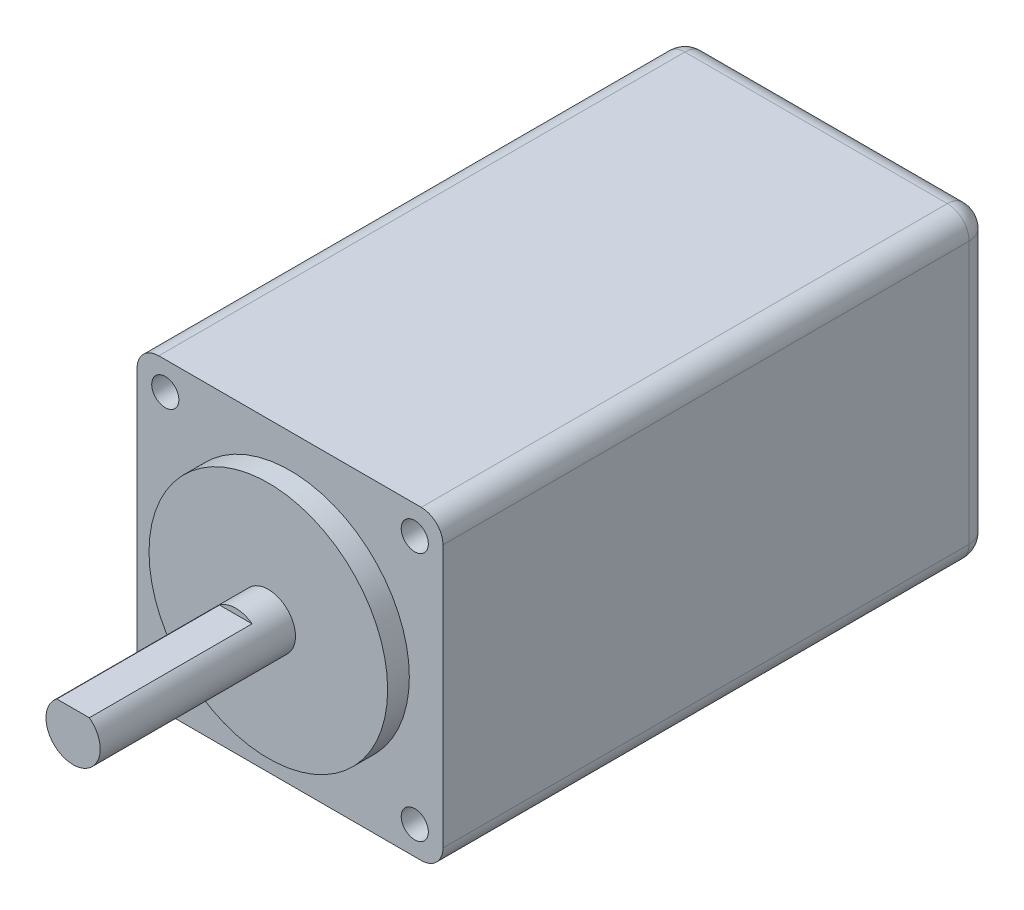
ISO-10303-21;
HEADER;
FILE_DESCRIPTION(('STEP AP214'),'2;1');
FILE_NAME('part.step','',(''),(''),'','','');
FILE_SCHEMA(('AUTOMOTIVE_DESIGN { 1 0 10303 214 1 1 1 1 }'));
ENDSEC;
DATA;
#1=APPLICATION_CONTEXT('core data for automotive mechanical design processes');
#2=APPLICATION_PROTOCOL_DEFINITION('international standard','automotive_design',2000,#1);
#3=PRODUCT_CONTEXT('',#1,'mechanical');
#4=PRODUCT('Part','Part','',(#3));
#5=PRODUCT_RELATED_PRODUCT_CATEGORY('part','',(#4));
#6=PRODUCT_DEFINITION_FORMATION('','',#4);
#7=PRODUCT_DEFINITION_CONTEXT('part definition',#1,'design');
#8=PRODUCT_DEFINITION('design','',#6,#7);
#9=PRODUCT_DEFINITION_SHAPE('','',#8);
#10=(LENGTH_UNIT() NAMED_UNIT(*) SI_UNIT(.MILLI.,.METRE.));
#11=(NAMED_UNIT(*) PLANE_ANGLE_UNIT() SI_UNIT($,.RADIAN.));
#12=(NAMED_UNIT(*) SI_UNIT($,.STERADIAN.) SOLID_ANGLE_UNIT());
#13=UNCERTAINTY_MEASURE_WITH_UNIT(LENGTH_MEASURE(1.E-05),#10,'distance_accuracy_value','');
#14=(GEOMETRIC_REPRESENTATION_CONTEXT(3) GLOBAL_UNCERTAINTY_ASSIGNED_CONTEXT((#13)) GLOBAL_UNIT_ASSIGNED_CONTEXT((#10,
#11,#12)) REPRESENTATION_CONTEXT('',''));
#15=CARTESIAN_POINT('',(0.,0.,0.));
#16=DIRECTION('',(0.,0.,1.));
#17=DIRECTION('',(1.,0.,0.));
#18=AXIS2_PLACEMENT_3D('',#15,#16,#17);
#19=CARTESIAN_POINT('',(0.,0.,52.5));
#20=DIRECTION('',(0.,0.,1.));
#21=DIRECTION('',(1.,0.,0.));
#22=AXIS2_PLACEMENT_3D('',#19,#20,#21);
#23=PLANE('',#22);
#24=CARTESIAN_POINT('',(0.,0.,52.5));
#25=DIRECTION('',(0.,0.,1.));
#26=DIRECTION('',(1.,0.,0.));
#27=AXIS2_PLACEMENT_3D('',#24,#25,#26);
#28=CIRCLE('',#27,11.);
#29=CARTESIAN_POINT('',(11.,0.,52.5));
#30=VERTEX_POINT('',#29);
#31=EDGE_CURVE('E144',#30,#30,#28,.T.);
#32=ORIENTED_EDGE('',*,*,#31,.T.);
#33=EDGE_LOOP('',(#32));
#34=FACE_BOUND('',#33,.T.);
#35=CARTESIAN_POINT('',(0.,0.,52.5));
#36=DIRECTION('',(0.,0.,1.));
#37=DIRECTION('',(1.,0.,0.));
#38=AXIS2_PLACEMENT_3D('',#35,#36,#37);
#39=CIRCLE('',#38,2.5);
#40=CARTESIAN_POINT('',(2.5,0.,52.5));
#41=VERTEX_POINT('',#40);
#42=EDGE_CURVE('E145',#41,#41,#39,.T.);
#43=ORIENTED_EDGE('',*,*,#42,.F.);
#44=EDGE_LOOP('',(#43));
#45=FACE_BOUND('',#44,.T.);
#46=ADVANCED_FACE('F33',(#34,#45),#23,.T.);
#47=CARTESIAN_POINT('',(14.1,14.1,50.5));
#48=DIRECTION('',(0.,0.,-1.));
#49=DIRECTION('',(-1.,0.,0.));
#50=AXIS2_PLACEMENT_3D('',#47,#48,#49);
#51=PLANE('',#50);
#52=CARTESIAN_POINT('',(-11.4999999999997,-11.5,50.5));
#53=DIRECTION('',(0.,0.,1.));
#54=DIRECTION('',(1.,0.,0.));
#55=AXIS2_PLACEMENT_3D('',#52,#53,#54);
#56=CIRCLE('',#55,1.25000000000024);
#57=CARTESIAN_POINT('',(-10.2499999999994,-11.5,50.5));
#58=VERTEX_POINT('',#57);
#59=EDGE_CURVE('E237',#58,#58,#56,.T.);
#60=ORIENTED_EDGE('',*,*,#59,.F.);
#61=EDGE_LOOP('',(#60));
#62=FACE_BOUND('',#61,.T.);
#63=CARTESIAN_POINT('',(11.5000000000003,-11.4999999999997,50.5));
#64=DIRECTION('',(0.,0.,1.));
#65=DIRECTION('',(1.,0.,0.));
#66=AXIS2_PLACEMENT_3D('',#63,#64,#65);
#67=CIRCLE('',#66,1.25000000000049);
#68=CARTESIAN_POINT('',(12.7500000000008,-11.4999999999997,50.5));
#69=VERTEX_POINT('',#68);
#70=EDGE_CURVE('E245',#69,#69,#67,.T.);
#71=ORIENTED_EDGE('',*,*,#70,.F.);
#72=EDGE_LOOP('',(#71));
#73=FACE_BOUND('',#72,.T.);
#74=CARTESIAN_POINT('',(11.5,11.5000000000003,50.5));
#75=DIRECTION('',(0.,0.,1.));
#76=DIRECTION('',(1.,0.,0.));
#77=AXIS2_PLACEMENT_3D('',#74,#75,#76);
#78=CIRCLE('',#77,1.25000000000035);
#79=CARTESIAN_POINT('',(12.7500000000003,11.5000000000003,50.5));
#80=VERTEX_POINT('',#79);
#81=EDGE_CURVE('E251',#80,#80,#78,.T.);
#82=ORIENTED_EDGE('',*,*,#81,.F.);
#83=EDGE_LOOP('',(#82));
#84=FACE_BOUND('',#83,.T.);
#85=CARTESIAN_POINT('',(-11.5,11.5,50.5));
#86=DIRECTION('',(0.,0.,1.));
#87=DIRECTION('',(1.,0.,0.));
#88=AXIS2_PLACEMENT_3D('',#85,#86,#87);
#89=CIRCLE('',#88,1.25);
#90=CARTESIAN_POINT('',(-10.25,11.5,50.5));
#91=VERTEX_POINT('',#90);
#92=EDGE_CURVE('E257',#91,#91,#89,.T.);
#93=ORIENTED_EDGE('',*,*,#92,.F.);
#94=EDGE_LOOP('',(#93));
#95=FACE_BOUND('',#94,.T.);
#96=DIRECTION('',(0.,-1.,0.));
#97=VECTOR('',#96,1.);
#98=CARTESIAN_POINT('',(-14.1,-14.1,50.5));
#99=LINE('',#98,#97);
#100=CARTESIAN_POINT('',(-14.1,12.1,50.5));
#101=VERTEX_POINT('',#100);
#102=CARTESIAN_POINT('',(-14.1,-12.1,50.5));
#103=VERTEX_POINT('',#102);
#104=EDGE_CURVE('E159',#101,#103,#99,.T.);
#105=ORIENTED_EDGE('',*,*,#104,.T.);
#106=CARTESIAN_POINT('',(-12.1,-12.1,50.5));
#107=DIRECTION('',(0.,0.,-1.));
#108=DIRECTION('',(-1.,0.,0.));
#109=AXIS2_PLACEMENT_3D('',#106,#107,#108);
#110=CIRCLE('',#109,2.);
#111=CARTESIAN_POINT('',(-12.1,-14.1,50.5));
#112=VERTEX_POINT('',#111);
#113=EDGE_CURVE('E11',#103,#112,#110,.F.);
#114=ORIENTED_EDGE('',*,*,#113,.T.);
#115=DIRECTION('',(1.,0.,0.));
#116=VECTOR('',#115,1.);
#117=CARTESIAN_POINT('',(-14.1,-14.1,50.5));
#118=LINE('',#117,#116);
#119=CARTESIAN_POINT('',(12.1,-14.1,50.5));
#120=VERTEX_POINT('',#119);
#121=EDGE_CURVE('E162',#112,#120,#118,.T.);
#122=ORIENTED_EDGE('',*,*,#121,.T.);
#123=CARTESIAN_POINT('',(12.1,-12.1,50.5));
#124=DIRECTION('',(0.,0.,-1.));
#125=DIRECTION('',(-1.,0.,0.));
#126=AXIS2_PLACEMENT_3D('',#123,#124,#125);
#127=CIRCLE('',#126,2.);
#128=CARTESIAN_POINT('',(14.1,-12.1,50.5));
#129=VERTEX_POINT('',#128);
#130=EDGE_CURVE('E42',#120,#129,#127,.F.);
#131=ORIENTED_EDGE('',*,*,#130,.T.);
#132=DIRECTION('',(0.,1.,0.));
#133=VECTOR('',#132,1.);
#134=CARTESIAN_POINT('',(14.1,-14.1,50.5));
#135=LINE('',#134,#133);
#136=CARTESIAN_POINT('',(14.1,12.1,50.5));
#137=VERTEX_POINT('',#136);
#138=EDGE_CURVE('E148',#129,#137,#135,.T.);
#139=ORIENTED_EDGE('',*,*,#138,.T.);
#140=CARTESIAN_POINT('',(12.1,12.1,50.5));
#141=DIRECTION('',(0.,0.,-1.));
#142=DIRECTION('',(-1.,0.,0.));
#143=AXIS2_PLACEMENT_3D('',#140,#141,#142);
#144=CIRCLE('',#143,2.);
#145=CARTESIAN_POINT('',(12.1,14.1,50.5));
#146=VERTEX_POINT('',#145);
#147=EDGE_CURVE('E200',#137,#146,#144,.F.);
#148=ORIENTED_EDGE('',*,*,#147,.T.);
#149=DIRECTION('',(-1.,0.,0.));
#150=VECTOR('',#149,1.);
#151=CARTESIAN_POINT('',(-14.1,14.1,50.5));
#152=LINE('',#151,#150);
#153=CARTESIAN_POINT('',(-12.1,14.1,50.5));
#154=VERTEX_POINT('',#153);
#155=EDGE_CURVE('E156',#146,#154,#152,.T.);
#156=ORIENTED_EDGE('',*,*,#155,.T.);
#157=CARTESIAN_POINT('',(-12.1,12.1,50.5));
#158=DIRECTION('',(0.,0.,-1.));
#159=DIRECTION('',(-1.,0.,0.));
#160=AXIS2_PLACEMENT_3D('',#157,#158,#159);
#161=CIRCLE('',#160,2.);
#162=EDGE_CURVE('E202',#154,#101,#161,.F.);
#163=ORIENTED_EDGE('',*,*,#162,.T.);
#164=EDGE_LOOP('',(#105,#114,#122,#131,#139,#148,#156,#163));
#165=FACE_BOUND('',#164,.T.);
#166=CARTESIAN_POINT('',(0.,0.,50.5));
#167=DIRECTION('',(0.,0.,-1.));
#168=DIRECTION('',(-1.,0.,0.));
#169=AXIS2_PLACEMENT_3D('',#166,#167,#168);
#170=CIRCLE('',#169,11.);
#171=CARTESIAN_POINT('',(-11.,0.,50.5));
#172=VERTEX_POINT('',#171);
#173=EDGE_CURVE('E134',#172,#172,#170,.F.);
#174=ORIENTED_EDGE('',*,*,#173,.F.);
#175=EDGE_LOOP('',(#174));
#176=FACE_BOUND('',#175,.T.);
#177=ADVANCED_FACE('F278',(#62,#73,#84,#95,#165,#176),#51,.F.);
#178=CARTESIAN_POINT('',(14.1,-14.1,50.5));
#179=DIRECTION('',(-1.,0.,0.));
#180=DIRECTION('',(0.,0.,1.));
#181=AXIS2_PLACEMENT_3D('',#178,#179,#180);
#182=PLANE('',#181);
#183=ORIENTED_EDGE('',*,*,#138,.F.);
#184=DIRECTION('',(0.,0.,-1.));
#185=VECTOR('',#184,1.);
#186=CARTESIAN_POINT('',(14.1,-12.1,50.5));
#187=LINE('',#186,#185);
#188=CARTESIAN_POINT('',(14.1,-12.1,2.));
#189=VERTEX_POINT('',#188);
#190=EDGE_CURVE('E50',#129,#189,#187,.T.);
#191=ORIENTED_EDGE('',*,*,#190,.T.);
#192=DIRECTION('',(0.,1.,0.));
#193=VECTOR('',#192,1.);
#194=CARTESIAN_POINT('',(14.1,14.1,2.));
#195=LINE('',#194,#193);
#196=CARTESIAN_POINT('',(14.1,12.1,2.));
#197=VERTEX_POINT('',#196);
#198=EDGE_CURVE('E55',#189,#197,#195,.T.);
#199=ORIENTED_EDGE('',*,*,#198,.T.);
#200=DIRECTION('',(0.,0.,-1.));
#201=VECTOR('',#200,1.);
#202=CARTESIAN_POINT('',(14.1,12.1,50.5));
#203=LINE('',#202,#201);
#204=EDGE_CURVE('E196',#197,#137,#203,.F.);
#205=ORIENTED_EDGE('',*,*,#204,.T.);
#206=EDGE_LOOP('',(#183,#191,#199,#205));
#207=FACE_BOUND('',#206,.T.);
#208=ADVANCED_FACE('F284',(#207),#182,.F.);
#209=CARTESIAN_POINT('',(-14.1,14.1,50.5));
#210=DIRECTION('',(0.,-1.,0.));
#211=DIRECTION('',(0.,0.,-1.));
#212=AXIS2_PLACEMENT_3D('',#209,#210,#211);
#213=PLANE('',#212);
#214=DIRECTION('',(-1.,0.,0.));
#215=VECTOR('',#214,1.);
#216=CARTESIAN_POINT('',(-14.1,14.1,2.));
#217=LINE('',#216,#215);
#218=CARTESIAN_POINT('',(12.1,14.1,2.));
#219=VERTEX_POINT('',#218);
#220=CARTESIAN_POINT('',(-12.1,14.1,2.));
#221=VERTEX_POINT('',#220);
#222=EDGE_CURVE('E170',#219,#221,#217,.T.);
#223=ORIENTED_EDGE('',*,*,#222,.T.);
#224=DIRECTION('',(0.,0.,-1.));
#225=VECTOR('',#224,1.);
#226=CARTESIAN_POINT('',(-12.1,14.1,50.5));
#227=LINE('',#226,#225);
#228=EDGE_CURVE('E173',#221,#154,#227,.F.);
#229=ORIENTED_EDGE('',*,*,#228,.T.);
#230=ORIENTED_EDGE('',*,*,#155,.F.);
#231=DIRECTION('',(0.,0.,-1.));
#232=VECTOR('',#231,1.);
#233=CARTESIAN_POINT('',(12.1,14.1,50.5));
#234=LINE('',#233,#232);
#235=EDGE_CURVE('E168',#146,#219,#234,.T.);
#236=ORIENTED_EDGE('',*,*,#235,.T.);
#237=EDGE_LOOP('',(#223,#229,#230,#236));
#238=FACE_BOUND('',#237,.T.);
#239=ADVANCED_FACE('F305',(#238),#213,.F.);
#240=CARTESIAN_POINT('',(-14.1,-14.1,50.5));
#241=DIRECTION('',(1.,0.,0.));
#242=DIRECTION('',(0.,0.,-1.));
#243=AXIS2_PLACEMENT_3D('',#240,#241,#242);
#244=PLANE('',#243);
#245=DIRECTION('',(0.,-1.,0.));
#246=VECTOR('',#245,1.);
#247=CARTESIAN_POINT('',(-14.1,-14.1,2.));
#248=LINE('',#247,#246);
#249=CARTESIAN_POINT('',(-14.1,12.1,2.));
#250=VERTEX_POINT('',#249);
#251=CARTESIAN_POINT('',(-14.1,-12.1,2.));
#252=VERTEX_POINT('',#251);
#253=EDGE_CURVE('E186',#250,#252,#248,.T.);
#254=ORIENTED_EDGE('',*,*,#253,.T.);
#255=DIRECTION('',(0.,0.,-1.));
#256=VECTOR('',#255,1.);
#257=CARTESIAN_POINT('',(-14.1,-12.1,50.5));
#258=LINE('',#257,#256);
#259=EDGE_CURVE('E188',#252,#103,#258,.F.);
#260=ORIENTED_EDGE('',*,*,#259,.T.);
#261=ORIENTED_EDGE('',*,*,#104,.F.);
#262=DIRECTION('',(0.,0.,-1.));
#263=VECTOR('',#262,1.);
#264=CARTESIAN_POINT('',(-14.1,12.1,50.5));
#265=LINE('',#264,#263);
#266=EDGE_CURVE('E184',#101,#250,#265,.T.);
#267=ORIENTED_EDGE('',*,*,#266,.T.);
#268=EDGE_LOOP('',(#254,#260,#261,#267));
#269=FACE_BOUND('',#268,.T.);
#270=ADVANCED_FACE('F301',(#269),#244,.F.);
#271=CARTESIAN_POINT('',(-14.1,-14.1,50.5));
#272=DIRECTION('',(0.,1.,0.));
#273=DIRECTION('',(0.,0.,1.));
#274=AXIS2_PLACEMENT_3D('',#271,#272,#273);
#275=PLANE('',#274);
#276=ORIENTED_EDGE('',*,*,#121,.F.);
#277=DIRECTION('',(0.,0.,-1.));
#278=VECTOR('',#277,1.);
#279=CARTESIAN_POINT('',(-12.1,-14.1,50.5));
#280=LINE('',#279,#278);
#281=CARTESIAN_POINT('',(-12.1,-14.1,2.));
#282=VERTEX_POINT('',#281);
#283=EDGE_CURVE('E194',#112,#282,#280,.T.);
#284=ORIENTED_EDGE('',*,*,#283,.T.);
#285=DIRECTION('',(1.,0.,0.));
#286=VECTOR('',#285,1.);
#287=CARTESIAN_POINT('',(14.1,-14.1,2.));
#288=LINE('',#287,#286);
#289=CARTESIAN_POINT('',(12.1,-14.1,2.));
#290=VERTEX_POINT('',#289);
#291=EDGE_CURVE('E192',#282,#290,#288,.T.);
#292=ORIENTED_EDGE('',*,*,#291,.T.);
#293=DIRECTION('',(0.,0.,-1.));
#294=VECTOR('',#293,1.);
#295=CARTESIAN_POINT('',(12.1,-14.1,50.5));
#296=LINE('',#295,#294);
#297=EDGE_CURVE('E190',#290,#120,#296,.F.);
#298=ORIENTED_EDGE('',*,*,#297,.T.);
#299=EDGE_LOOP('',(#276,#284,#292,#298));
#300=FACE_BOUND('',#299,.T.);
#301=ADVANCED_FACE('F297',(#300),#275,.F.);
#302=CARTESIAN_POINT('',(14.1,14.1,0.));
#303=DIRECTION('',(0.,0.,-1.));
#304=DIRECTION('',(-1.,0.,0.));
#305=AXIS2_PLACEMENT_3D('',#302,#303,#304);
#306=PLANE('',#305);
#307=DIRECTION('',(0.,-1.,0.));
#308=VECTOR('',#307,1.);
#309=CARTESIAN_POINT('',(-12.1,14.1,0.));
#310=LINE('',#309,#308);
#311=CARTESIAN_POINT('',(-12.1,-12.1,0.));
#312=VERTEX_POINT('',#311);
#313=CARTESIAN_POINT('',(-12.1,12.1,0.));
#314=VERTEX_POINT('',#313);
#315=EDGE_CURVE('E179',#312,#314,#310,.F.);
#316=ORIENTED_EDGE('',*,*,#315,.T.);
#317=DIRECTION('',(-1.,0.,0.));
#318=VECTOR('',#317,1.);
#319=CARTESIAN_POINT('',(14.1,12.1,0.));
#320=LINE('',#319,#318);
#321=CARTESIAN_POINT('',(12.1,12.1,0.));
#322=VERTEX_POINT('',#321);
#323=EDGE_CURVE('E181',#314,#322,#320,.F.);
#324=ORIENTED_EDGE('',*,*,#323,.T.);
#325=DIRECTION('',(0.,1.,0.));
#326=VECTOR('',#325,1.);
#327=CARTESIAN_POINT('',(12.1,-14.1,0.));
#328=LINE('',#327,#326);
#329=CARTESIAN_POINT('',(12.1,-12.1,0.));
#330=VERTEX_POINT('',#329);
#331=EDGE_CURVE('E175',#322,#330,#328,.F.);
#332=ORIENTED_EDGE('',*,*,#331,.T.);
#333=DIRECTION('',(1.,0.,0.));
#334=VECTOR('',#333,1.);
#335=CARTESIAN_POINT('',(-14.1,-12.1,0.));
#336=LINE('',#335,#334);
#337=EDGE_CURVE('E177',#330,#312,#336,.F.);
#338=ORIENTED_EDGE('',*,*,#337,.T.);
#339=EDGE_LOOP('',(#316,#324,#332,#338));
#340=FACE_BOUND('',#339,.T.);
#341=ADVANCED_FACE('F292',(#340),#306,.T.);
#342=CARTESIAN_POINT('',(0.,0.,52.5));
#343=DIRECTION('',(0.,0.,-1.));
#344=DIRECTION('',(-1.,0.,0.));
#345=AXIS2_PLACEMENT_3D('',#342,#343,#344);
#346=CYLINDRICAL_SURFACE('',#345,11.);
#347=ORIENTED_EDGE('',*,*,#31,.F.);
#348=EDGE_LOOP('',(#347));
#349=FACE_BOUND('',#348,.T.);
#350=ORIENTED_EDGE('',*,*,#173,.T.);
#351=EDGE_LOOP('',(#350));
#352=FACE_BOUND('',#351,.T.);
#353=ADVANCED_FACE('F290',(#349,#352),#346,.T.);
#354=CARTESIAN_POINT('',(0.,0.,70.5));
#355=DIRECTION('',(0.,0.,-1.));
#356=DIRECTION('',(-1.,0.,0.));
#357=AXIS2_PLACEMENT_3D('',#354,#355,#356);
#358=CYLINDRICAL_SURFACE('',#357,2.5);
#359=CARTESIAN_POINT('',(0.,0.,70.5));
#360=DIRECTION('',(0.,0.,1.));
#361=DIRECTION('',(1.,0.,0.));
#362=AXIS2_PLACEMENT_3D('',#359,#360,#361);
#363=CIRCLE('',#362,2.5);
#364=CARTESIAN_POINT('',(-1.5,2.,70.5));
#365=VERTEX_POINT('',#364);
#366=CARTESIAN_POINT('',(1.5,2.,70.5));
#367=VERTEX_POINT('',#366);
#368=EDGE_CURVE('E140',#365,#367,#363,.T.);
#369=ORIENTED_EDGE('',*,*,#368,.F.);
#370=DIRECTION('',(0.,0.,-1.));
#371=VECTOR('',#370,1.);
#372=CARTESIAN_POINT('',(-1.5,2.,70.5));
#373=LINE('',#372,#371);
#374=CARTESIAN_POINT('',(-1.5,2.,55.5));
#375=VERTEX_POINT('',#374);
#376=EDGE_CURVE('E129',#365,#375,#373,.T.);
#377=ORIENTED_EDGE('',*,*,#376,.T.);
#378=CARTESIAN_POINT('',(0.,0.,55.5));
#379=DIRECTION('',(0.,0.,-1.));
#380=DIRECTION('',(-1.,0.,0.));
#381=AXIS2_PLACEMENT_3D('',#378,#379,#380);
#382=CIRCLE('',#381,2.5);
#383=CARTESIAN_POINT('',(1.5,2.,55.5));
#384=VERTEX_POINT('',#383);
#385=EDGE_CURVE('E133',#375,#384,#382,.T.);
#386=ORIENTED_EDGE('',*,*,#385,.T.);
#387=DIRECTION('',(0.,0.,-1.));
#388=VECTOR('',#387,1.);
#389=CARTESIAN_POINT('',(1.5,2.,70.5));
#390=LINE('',#389,#388);
#391=EDGE_CURVE('E126',#384,#367,#390,.F.);
#392=ORIENTED_EDGE('',*,*,#391,.T.);
#393=EDGE_LOOP('',(#369,#377,#386,#392));
#394=FACE_BOUND('',#393,.T.);
#395=ORIENTED_EDGE('',*,*,#42,.T.);
#396=EDGE_LOOP('',(#395));
#397=FACE_BOUND('',#396,.T.);
#398=ADVANCED_FACE('F138',(#394,#397),#358,.T.);
#399=CARTESIAN_POINT('',(0.,0.,70.5));
#400=DIRECTION('',(0.,0.,1.));
#401=DIRECTION('',(1.,0.,0.));
#402=AXIS2_PLACEMENT_3D('',#399,#400,#401);
#403=PLANE('',#402);
#404=DIRECTION('',(1.,0.,0.));
#405=VECTOR('',#404,1.);
#406=CARTESIAN_POINT('',(0.,2.,70.5));
#407=LINE('',#406,#405);
#408=EDGE_CURVE('E122',#365,#367,#407,.T.);
#409=ORIENTED_EDGE('',*,*,#408,.F.);
#410=ORIENTED_EDGE('',*,*,#368,.T.);
#411=EDGE_LOOP('',(#409,#410));
#412=FACE_BOUND('',#411,.T.);
#413=ADVANCED_FACE('F143',(#412),#403,.T.);
#414=CARTESIAN_POINT('',(-5.,2.5,55.5));
#415=DIRECTION('',(0.,0.,-1.));
#416=DIRECTION('',(-1.,0.,0.));
#417=AXIS2_PLACEMENT_3D('',#414,#415,#416);
#418=PLANE('',#417);
#419=DIRECTION('',(1.,0.,0.));
#420=VECTOR('',#419,1.);
#421=CARTESIAN_POINT('',(-5.,2.,55.5));
#422=LINE('',#421,#420);
#423=EDGE_CURVE('E141',#375,#384,#422,.T.);
#424=ORIENTED_EDGE('',*,*,#423,.T.);
#425=ORIENTED_EDGE('',*,*,#385,.F.);
#426=EDGE_LOOP('',(#424,#425));
#427=FACE_BOUND('',#426,.T.);
#428=ADVANCED_FACE('F266',(#427),#418,.F.);
#429=CARTESIAN_POINT('',(-5.,2.,70.5));
#430=DIRECTION('',(0.,-1.,0.));
#431=DIRECTION('',(0.,0.,-1.));
#432=AXIS2_PLACEMENT_3D('',#429,#430,#431);
#433=PLANE('',#432);
#434=ORIENTED_EDGE('',*,*,#408,.T.);
#435=ORIENTED_EDGE('',*,*,#391,.F.);
#436=ORIENTED_EDGE('',*,*,#423,.F.);
#437=ORIENTED_EDGE('',*,*,#376,.F.);
#438=EDGE_LOOP('',(#434,#435,#436,#437));
#439=FACE_BOUND('',#438,.T.);
#440=ADVANCED_FACE('F124',(#439),#433,.F.);
#441=CARTESIAN_POINT('',(-11.5,11.5,48.));
#442=DIRECTION('',(0.,0.,1.));
#443=DIRECTION('',(1.,0.,0.));
#444=AXIS2_PLACEMENT_3D('',#441,#442,#443);
#445=CYLINDRICAL_SURFACE('',#444,1.25);
#446=CARTESIAN_POINT('',(-11.5,11.5,48.));
#447=DIRECTION('',(0.,0.,1.));
#448=DIRECTION('',(1.,0.,0.));
#449=AXIS2_PLACEMENT_3D('',#446,#447,#448);
#450=CIRCLE('',#449,1.25);
#451=CARTESIAN_POINT('',(-10.25,11.5,48.));
#452=VERTEX_POINT('',#451);
#453=EDGE_CURVE('E260',#452,#452,#450,.T.);
#454=ORIENTED_EDGE('',*,*,#453,.F.);
#455=EDGE_LOOP('',(#454));
#456=FACE_BOUND('',#455,.T.);
#457=ORIENTED_EDGE('',*,*,#92,.T.);
#458=EDGE_LOOP('',(#457));
#459=FACE_BOUND('',#458,.T.);
#460=ADVANCED_FACE('F273',(#456,#459),#445,.F.);
#461=CARTESIAN_POINT('',(-11.5,11.5,48.));
#462=DIRECTION('',(0.,0.,1.));
#463=DIRECTION('',(1.,0.,0.));
#464=AXIS2_PLACEMENT_3D('',#461,#462,#463);
#465=PLANE('',#464);
#466=ORIENTED_EDGE('',*,*,#453,.T.);
#467=EDGE_LOOP('',(#466));
#468=FACE_BOUND('',#467,.T.);
#469=ADVANCED_FACE('F418',(#468),#465,.T.);
#470=CARTESIAN_POINT('',(11.5,11.5000000000003,48.));
#471=DIRECTION('',(0.,0.,1.));
#472=DIRECTION('',(1.,0.,0.));
#473=AXIS2_PLACEMENT_3D('',#470,#471,#472);
#474=CYLINDRICAL_SURFACE('',#473,1.25000000000035);
#475=CARTESIAN_POINT('',(11.5,11.5000000000003,48.));
#476=DIRECTION('',(0.,0.,1.));
#477=DIRECTION('',(1.,0.,0.));
#478=AXIS2_PLACEMENT_3D('',#475,#476,#477);
#479=CIRCLE('',#478,1.25000000000035);
#480=CARTESIAN_POINT('',(12.7500000000003,11.5000000000003,48.));
#481=VERTEX_POINT('',#480);
#482=EDGE_CURVE('E254',#481,#481,#479,.T.);
#483=ORIENTED_EDGE('',*,*,#482,.F.);
#484=EDGE_LOOP('',(#483));
#485=FACE_BOUND('',#484,.T.);
#486=ORIENTED_EDGE('',*,*,#81,.T.);
#487=EDGE_LOOP('',(#486));
#488=FACE_BOUND('',#487,.T.);
#489=ADVANCED_FACE('F414',(#485,#488),#474,.F.);
#490=CARTESIAN_POINT('',(11.5,11.5000000000003,48.));
#491=DIRECTION('',(0.,0.,1.));
#492=DIRECTION('',(1.,0.,0.));
#493=AXIS2_PLACEMENT_3D('',#490,#491,#492);
#494=PLANE('',#493);
#495=ORIENTED_EDGE('',*,*,#482,.T.);
#496=EDGE_LOOP('',(#495));
#497=FACE_BOUND('',#496,.T.);
#498=ADVANCED_FACE('F410',(#497),#494,.T.);
#499=CARTESIAN_POINT('',(11.5000000000003,-11.4999999999997,48.));
#500=DIRECTION('',(0.,0.,1.));
#501=DIRECTION('',(1.,0.,0.));
#502=AXIS2_PLACEMENT_3D('',#499,#500,#501);
#503=CYLINDRICAL_SURFACE('',#502,1.25000000000049);
#504=CARTESIAN_POINT('',(11.5000000000003,-11.4999999999997,48.));
#505=DIRECTION('',(0.,0.,1.));
#506=DIRECTION('',(1.,0.,0.));
#507=AXIS2_PLACEMENT_3D('',#504,#505,#506);
#508=CIRCLE('',#507,1.25000000000049);
#509=CARTESIAN_POINT('',(12.7500000000008,-11.4999999999997,48.));
#510=VERTEX_POINT('',#509);
#511=EDGE_CURVE('E248',#510,#510,#508,.T.);
#512=ORIENTED_EDGE('',*,*,#511,.F.);
#513=EDGE_LOOP('',(#512));
#514=FACE_BOUND('',#513,.T.);
#515=ORIENTED_EDGE('',*,*,#70,.T.);
#516=EDGE_LOOP('',(#515));
#517=FACE_BOUND('',#516,.T.);
#518=ADVANCED_FACE('F406',(#514,#517),#503,.F.);
#519=CARTESIAN_POINT('',(11.5000000000003,-11.4999999999997,48.));
#520=DIRECTION('',(0.,0.,1.));
#521=DIRECTION('',(1.,0.,0.));
#522=AXIS2_PLACEMENT_3D('',#519,#520,#521);
#523=PLANE('',#522);
#524=ORIENTED_EDGE('',*,*,#511,.T.);
#525=EDGE_LOOP('',(#524));
#526=FACE_BOUND('',#525,.T.);
#527=ADVANCED_FACE('F400',(#526),#523,.T.);
#528=CARTESIAN_POINT('',(-11.4999999999997,-11.5,48.));
#529=DIRECTION('',(0.,0.,1.));
#530=DIRECTION('',(1.,0.,0.));
#531=AXIS2_PLACEMENT_3D('',#528,#529,#530);
#532=CYLINDRICAL_SURFACE('',#531,1.25000000000024);
#533=CARTESIAN_POINT('',(-11.4999999999997,-11.5,48.));
#534=DIRECTION('',(0.,0.,1.));
#535=DIRECTION('',(1.,0.,0.));
#536=AXIS2_PLACEMENT_3D('',#533,#534,#535);
#537=CIRCLE('',#536,1.25000000000024);
#538=CARTESIAN_POINT('',(-10.2499999999994,-11.5,48.));
#539=VERTEX_POINT('',#538);
#540=EDGE_CURVE('E240',#539,#539,#537,.T.);
#541=ORIENTED_EDGE('',*,*,#540,.F.);
#542=EDGE_LOOP('',(#541));
#543=FACE_BOUND('',#542,.T.);
#544=ORIENTED_EDGE('',*,*,#59,.T.);
#545=EDGE_LOOP('',(#544));
#546=FACE_BOUND('',#545,.T.);
#547=ADVANCED_FACE('F394',(#543,#546),#532,.F.);
#548=CARTESIAN_POINT('',(-11.4999999999997,-11.5,48.));
#549=DIRECTION('',(0.,0.,1.));
#550=DIRECTION('',(1.,0.,0.));
#551=AXIS2_PLACEMENT_3D('',#548,#549,#550);
#552=PLANE('',#551);
#553=ORIENTED_EDGE('',*,*,#540,.T.);
#554=EDGE_LOOP('',(#553));
#555=FACE_BOUND('',#554,.T.);
#556=ADVANCED_FACE('F356',(#555),#552,.T.);
#557=CARTESIAN_POINT('',(12.1,-12.1,50.5));
#558=DIRECTION('',(0.,0.,-1.));
#559=DIRECTION('',(-1.,0.,0.));
#560=AXIS2_PLACEMENT_3D('',#557,#558,#559);
#561=CYLINDRICAL_SURFACE('',#560,2.);
#562=ORIENTED_EDGE('',*,*,#130,.F.);
#563=ORIENTED_EDGE('',*,*,#297,.F.);
#564=CARTESIAN_POINT('',(12.1,-12.1,2.));
#565=DIRECTION('',(0.,0.,-1.));
#566=DIRECTION('',(-1.,0.,0.));
#567=AXIS2_PLACEMENT_3D('',#564,#565,#566);
#568=CIRCLE('',#567,2.);
#569=EDGE_CURVE('E232',#189,#290,#568,.T.);
#570=ORIENTED_EDGE('',*,*,#569,.F.);
#571=ORIENTED_EDGE('',*,*,#190,.F.);
#572=EDGE_LOOP('',(#562,#563,#570,#571));
#573=FACE_BOUND('',#572,.T.);
#574=ADVANCED_FACE('F35',(#573),#561,.T.);
#575=CARTESIAN_POINT('',(-12.1,-12.1,50.5));
#576=DIRECTION('',(0.,0.,-1.));
#577=DIRECTION('',(-1.,0.,0.));
#578=AXIS2_PLACEMENT_3D('',#575,#576,#577);
#579=CYLINDRICAL_SURFACE('',#578,2.);
#580=ORIENTED_EDGE('',*,*,#113,.F.);
#581=ORIENTED_EDGE('',*,*,#259,.F.);
#582=CARTESIAN_POINT('',(-12.1,-12.1,2.));
#583=DIRECTION('',(0.,0.,-1.));
#584=DIRECTION('',(-1.,0.,0.));
#585=AXIS2_PLACEMENT_3D('',#582,#583,#584);
#586=CIRCLE('',#585,2.);
#587=EDGE_CURVE('E230',#282,#252,#586,.T.);
#588=ORIENTED_EDGE('',*,*,#587,.F.);
#589=ORIENTED_EDGE('',*,*,#283,.F.);
#590=EDGE_LOOP('',(#580,#581,#588,#589));
#591=FACE_BOUND('',#590,.T.);
#592=ADVANCED_FACE('F349',(#591),#579,.T.);
#593=CARTESIAN_POINT('',(-14.1,-12.1,2.));
#594=DIRECTION('',(-1.,0.,0.));
#595=DIRECTION('',(0.,0.,1.));
#596=AXIS2_PLACEMENT_3D('',#593,#594,#595);
#597=CYLINDRICAL_SURFACE('',#596,2.);
#598=CARTESIAN_POINT('',(12.1,-12.1,2.));
#599=DIRECTION('',(1.,0.,0.));
#600=DIRECTION('',(0.,0.,-1.));
#601=AXIS2_PLACEMENT_3D('',#598,#599,#600);
#602=CIRCLE('',#601,2.);
#603=EDGE_CURVE('E37',#290,#330,#602,.T.);
#604=ORIENTED_EDGE('',*,*,#603,.F.);
#605=ORIENTED_EDGE('',*,*,#291,.F.);
#606=CARTESIAN_POINT('',(-12.1,-12.1,2.));
#607=DIRECTION('',(-1.,0.,0.));
#608=DIRECTION('',(0.,0.,1.));
#609=AXIS2_PLACEMENT_3D('',#606,#607,#608);
#610=CIRCLE('',#609,2.);
#611=EDGE_CURVE('E227',#312,#282,#610,.T.);
#612=ORIENTED_EDGE('',*,*,#611,.F.);
#613=ORIENTED_EDGE('',*,*,#337,.F.);
#614=EDGE_LOOP('',(#604,#605,#612,#613));
#615=FACE_BOUND('',#614,.T.);
#616=ADVANCED_FACE('F347',(#615),#597,.T.);
#617=CARTESIAN_POINT('',(12.1,-12.1,2.));
#618=DIRECTION('',(0.,0.,1.));
#619=DIRECTION('',(1.,0.,0.));
#620=AXIS2_PLACEMENT_3D('',#617,#618,#619);
#621=SPHERICAL_SURFACE('',#620,2.);
#622=ORIENTED_EDGE('',*,*,#569,.T.);
#623=ORIENTED_EDGE('',*,*,#603,.T.);
#624=CARTESIAN_POINT('',(12.1,-12.1,2.));
#625=DIRECTION('',(0.,-1.,0.));
#626=DIRECTION('',(0.,0.,-1.));
#627=AXIS2_PLACEMENT_3D('',#624,#625,#626);
#628=CIRCLE('',#627,2.);
#629=EDGE_CURVE('E224',#189,#330,#628,.F.);
#630=ORIENTED_EDGE('',*,*,#629,.F.);
#631=EDGE_LOOP('',(#622,#623,#630));
#632=FACE_BOUND('',#631,.T.);
#633=ADVANCED_FACE('F343',(#632),#621,.T.);
#634=CARTESIAN_POINT('',(-12.1,-12.1,2.));
#635=DIRECTION('',(0.,0.,1.));
#636=DIRECTION('',(1.,0.,0.));
#637=AXIS2_PLACEMENT_3D('',#634,#635,#636);
#638=SPHERICAL_SURFACE('',#637,2.);
#639=ORIENTED_EDGE('',*,*,#611,.T.);
#640=ORIENTED_EDGE('',*,*,#587,.T.);
#641=CARTESIAN_POINT('',(-12.1,-12.1,2.));
#642=DIRECTION('',(0.,-1.,0.));
#643=DIRECTION('',(0.,0.,-1.));
#644=AXIS2_PLACEMENT_3D('',#641,#642,#643);
#645=CIRCLE('',#644,2.);
#646=EDGE_CURVE('E221',#312,#252,#645,.F.);
#647=ORIENTED_EDGE('',*,*,#646,.F.);
#648=EDGE_LOOP('',(#639,#640,#647));
#649=FACE_BOUND('',#648,.T.);
#650=ADVANCED_FACE('F339',(#649),#638,.T.);
#651=CARTESIAN_POINT('',(12.1,-14.1,2.));
#652=DIRECTION('',(0.,-1.,0.));
#653=DIRECTION('',(0.,0.,-1.));
#654=AXIS2_PLACEMENT_3D('',#651,#652,#653);
#655=CYLINDRICAL_SURFACE('',#654,2.);
#656=ORIENTED_EDGE('',*,*,#629,.T.);
#657=ORIENTED_EDGE('',*,*,#331,.F.);
#658=CARTESIAN_POINT('',(12.1,12.1,2.));
#659=DIRECTION('',(0.,1.,0.));
#660=DIRECTION('',(0.,0.,1.));
#661=AXIS2_PLACEMENT_3D('',#658,#659,#660);
#662=CIRCLE('',#661,2.);
#663=EDGE_CURVE('E218',#197,#322,#662,.T.);
#664=ORIENTED_EDGE('',*,*,#663,.F.);
#665=ORIENTED_EDGE('',*,*,#198,.F.);
#666=EDGE_LOOP('',(#656,#657,#664,#665));
#667=FACE_BOUND('',#666,.T.);
#668=ADVANCED_FACE('F335',(#667),#655,.T.);
#669=CARTESIAN_POINT('',(12.1,12.1,50.5));
#670=DIRECTION('',(0.,0.,-1.));
#671=DIRECTION('',(-1.,0.,0.));
#672=AXIS2_PLACEMENT_3D('',#669,#670,#671);
#673=CYLINDRICAL_SURFACE('',#672,2.);
#674=ORIENTED_EDGE('',*,*,#147,.F.);
#675=ORIENTED_EDGE('',*,*,#204,.F.);
#676=CARTESIAN_POINT('',(12.1,12.1,2.));
#677=DIRECTION('',(0.,0.,-1.));
#678=DIRECTION('',(-1.,0.,0.));
#679=AXIS2_PLACEMENT_3D('',#676,#677,#678);
#680=CIRCLE('',#679,2.);
#681=EDGE_CURVE('E215',#219,#197,#680,.T.);
#682=ORIENTED_EDGE('',*,*,#681,.F.);
#683=ORIENTED_EDGE('',*,*,#235,.F.);
#684=EDGE_LOOP('',(#674,#675,#682,#683));
#685=FACE_BOUND('',#684,.T.);
#686=ADVANCED_FACE('F331',(#685),#673,.T.);
#687=CARTESIAN_POINT('',(-12.1,12.1,50.5));
#688=DIRECTION('',(0.,0.,-1.));
#689=DIRECTION('',(-1.,0.,0.));
#690=AXIS2_PLACEMENT_3D('',#687,#688,#689);
#691=CYLINDRICAL_SURFACE('',#690,2.);
#692=ORIENTED_EDGE('',*,*,#162,.F.);
#693=ORIENTED_EDGE('',*,*,#228,.F.);
#694=CARTESIAN_POINT('',(-12.1,12.1,2.));
#695=DIRECTION('',(0.,0.,-1.));
#696=DIRECTION('',(-1.,0.,0.));
#697=AXIS2_PLACEMENT_3D('',#694,#695,#696);
#698=CIRCLE('',#697,2.);
#699=EDGE_CURVE('E212',#250,#221,#698,.T.);
#700=ORIENTED_EDGE('',*,*,#699,.F.);
#701=ORIENTED_EDGE('',*,*,#266,.F.);
#702=EDGE_LOOP('',(#692,#693,#700,#701));
#703=FACE_BOUND('',#702,.T.);
#704=ADVANCED_FACE('F327',(#703),#691,.T.);
#705=CARTESIAN_POINT('',(-12.1,-14.1,2.));
#706=DIRECTION('',(0.,1.,0.));
#707=DIRECTION('',(0.,0.,1.));
#708=AXIS2_PLACEMENT_3D('',#705,#706,#707);
#709=CYLINDRICAL_SURFACE('',#708,2.);
#710=ORIENTED_EDGE('',*,*,#646,.T.);
#711=ORIENTED_EDGE('',*,*,#253,.F.);
#712=CARTESIAN_POINT('',(-12.1,12.1,2.));
#713=DIRECTION('',(0.,1.,0.));
#714=DIRECTION('',(-1.,0.,0.));
#715=AXIS2_PLACEMENT_3D('',#712,#713,#714);
#716=CIRCLE('',#715,2.);
#717=EDGE_CURVE('E209',#314,#250,#716,.T.);
#718=ORIENTED_EDGE('',*,*,#717,.F.);
#719=ORIENTED_EDGE('',*,*,#315,.F.);
#720=EDGE_LOOP('',(#710,#711,#718,#719));
#721=FACE_BOUND('',#720,.T.);
#722=ADVANCED_FACE('F323',(#721),#709,.T.);
#723=CARTESIAN_POINT('',(12.1,12.1,2.));
#724=DIRECTION('',(0.,0.,1.));
#725=DIRECTION('',(1.,0.,0.));
#726=AXIS2_PLACEMENT_3D('',#723,#724,#725);
#727=SPHERICAL_SURFACE('',#726,2.);
#728=ORIENTED_EDGE('',*,*,#681,.T.);
#729=ORIENTED_EDGE('',*,*,#663,.T.);
#730=CARTESIAN_POINT('',(12.1,12.1,2.));
#731=DIRECTION('',(1.,0.,0.));
#732=DIRECTION('',(0.,1.,0.));
#733=AXIS2_PLACEMENT_3D('',#730,#731,#732);
#734=CIRCLE('',#733,2.);
#735=EDGE_CURVE('E207',#219,#322,#734,.F.);
#736=ORIENTED_EDGE('',*,*,#735,.F.);
#737=EDGE_LOOP('',(#728,#729,#736));
#738=FACE_BOUND('',#737,.T.);
#739=ADVANCED_FACE('F319',(#738),#727,.T.);
#740=CARTESIAN_POINT('',(-12.1,12.1,2.));
#741=DIRECTION('',(0.,0.,1.));
#742=DIRECTION('',(1.,0.,0.));
#743=AXIS2_PLACEMENT_3D('',#740,#741,#742);
#744=SPHERICAL_SURFACE('',#743,2.);
#745=ORIENTED_EDGE('',*,*,#717,.T.);
#746=ORIENTED_EDGE('',*,*,#699,.T.);
#747=CARTESIAN_POINT('',(-12.1,12.1,2.));
#748=DIRECTION('',(-1.,0.,0.));
#749=DIRECTION('',(0.,0.,1.));
#750=AXIS2_PLACEMENT_3D('',#747,#748,#749);
#751=CIRCLE('',#750,2.);
#752=EDGE_CURVE('E205',#314,#221,#751,.F.);
#753=ORIENTED_EDGE('',*,*,#752,.F.);
#754=EDGE_LOOP('',(#745,#746,#753));
#755=FACE_BOUND('',#754,.T.);
#756=ADVANCED_FACE('F315',(#755),#744,.T.);
#757=CARTESIAN_POINT('',(-14.1,12.1,2.));
#758=DIRECTION('',(1.,0.,0.));
#759=DIRECTION('',(0.,0.,-1.));
#760=AXIS2_PLACEMENT_3D('',#757,#758,#759);
#761=CYLINDRICAL_SURFACE('',#760,2.);
#762=ORIENTED_EDGE('',*,*,#735,.T.);
#763=ORIENTED_EDGE('',*,*,#323,.F.);
#764=ORIENTED_EDGE('',*,*,#752,.T.);
#765=ORIENTED_EDGE('',*,*,#222,.F.);
#766=EDGE_LOOP('',(#762,#763,#764,#765));
#767=FACE_BOUND('',#766,.T.);
#768=ADVANCED_FACE('F312',(#767),#761,.T.);
#769=CLOSED_SHELL('',(#46,#177,#208,#239,#270,#301,#341,#353,#398,#413,#428,#440,#460,#469,#489,
#498,#518,#527,#547,#556,#574,#592,#616,#633,#650,#668,#686,#704,#722,#739,#756,#768));
#770=MANIFOLD_SOLID_BREP('B2',#769);
#771=ADVANCED_BREP_SHAPE_REPRESENTATION('',(#18,#770),#14);
#772=SHAPE_DEFINITION_REPRESENTATION(#9,#771);
ENDSEC;
END-ISO-10303-21;
